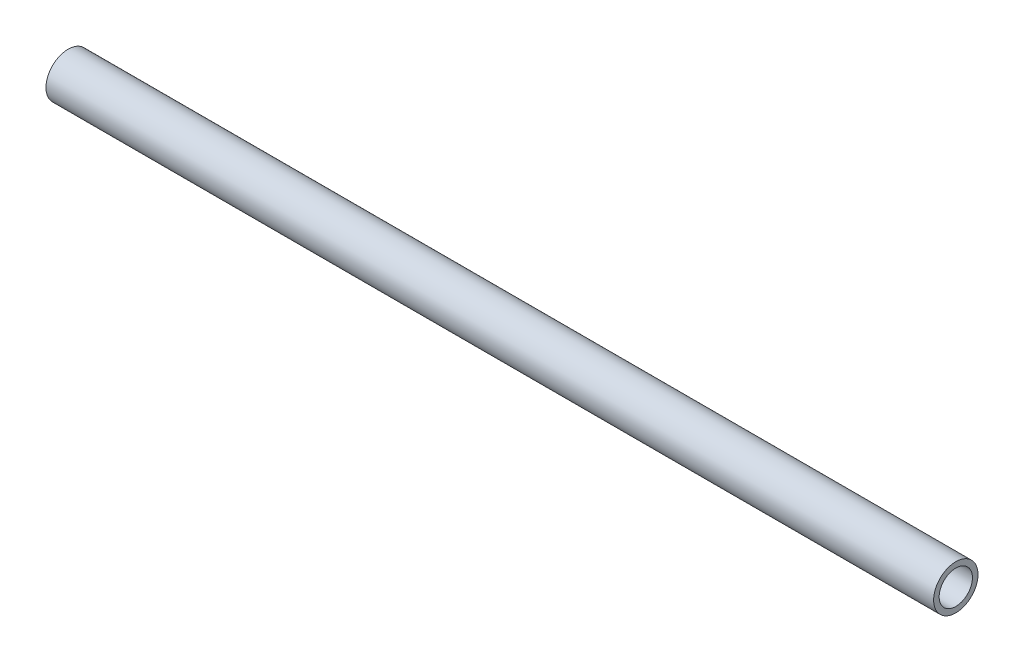
ISO-10303-21;
HEADER;
FILE_DESCRIPTION(('STEP AP214'),'2;1');
FILE_NAME('part.step','',(''),(''),'','','');
FILE_SCHEMA(('AUTOMOTIVE_DESIGN { 1 0 10303 214 1 1 1 1 }'));
ENDSEC;
DATA;
#1=APPLICATION_CONTEXT('core data for automotive mechanical design processes');
#2=APPLICATION_PROTOCOL_DEFINITION('international standard','automotive_design',2000,#1);
#3=PRODUCT_CONTEXT('',#1,'mechanical');
#4=PRODUCT('Part','Part','',(#3));
#5=PRODUCT_RELATED_PRODUCT_CATEGORY('part','',(#4));
#6=PRODUCT_DEFINITION_FORMATION('','',#4);
#7=PRODUCT_DEFINITION_CONTEXT('part definition',#1,'design');
#8=PRODUCT_DEFINITION('design','',#6,#7);
#9=PRODUCT_DEFINITION_SHAPE('','',#8);
#10=(LENGTH_UNIT() NAMED_UNIT(*) SI_UNIT(.MILLI.,.METRE.));
#11=(NAMED_UNIT(*) PLANE_ANGLE_UNIT() SI_UNIT($,.RADIAN.));
#12=(NAMED_UNIT(*) SI_UNIT($,.STERADIAN.) SOLID_ANGLE_UNIT());
#13=UNCERTAINTY_MEASURE_WITH_UNIT(LENGTH_MEASURE(1.E-05),#10,'distance_accuracy_value','');
#14=(GEOMETRIC_REPRESENTATION_CONTEXT(3) GLOBAL_UNCERTAINTY_ASSIGNED_CONTEXT((#13)) GLOBAL_UNIT_ASSIGNED_CONTEXT((#10,
#11,#12)) REPRESENTATION_CONTEXT('',''));
#15=CARTESIAN_POINT('',(0.,0.,0.));
#16=DIRECTION('',(0.,0.,1.));
#17=DIRECTION('',(1.,0.,0.));
#18=AXIS2_PLACEMENT_3D('',#15,#16,#17);
#19=CARTESIAN_POINT('',(457.2,0.,0.));
#20=DIRECTION('',(1.,0.,0.));
#21=DIRECTION('',(0.,0.,-1.));
#22=AXIS2_PLACEMENT_3D('',#19,#20,#21);
#23=PLANE('',#22);
#24=CARTESIAN_POINT('',(457.2,0.,0.));
#25=DIRECTION('',(1.,0.,0.));
#26=DIRECTION('',(0.,0.,-1.));
#27=AXIS2_PLACEMENT_3D('',#24,#25,#26);
#28=CIRCLE('',#27,12.7);
#29=CARTESIAN_POINT('',(457.2,0.,-12.7));
#30=VERTEX_POINT('',#29);
#31=EDGE_CURVE('E11',#30,#30,#28,.T.);
#32=ORIENTED_EDGE('',*,*,#31,.T.);
#33=EDGE_LOOP('',(#32));
#34=FACE_BOUND('',#33,.T.);
#35=CARTESIAN_POINT('',(457.2,0.,0.));
#36=DIRECTION('',(1.,0.,0.));
#37=DIRECTION('',(0.,0.,-1.));
#38=AXIS2_PLACEMENT_3D('',#35,#36,#37);
#39=CIRCLE('',#38,9.525);
#40=CARTESIAN_POINT('',(457.2,0.,-9.525));
#41=VERTEX_POINT('',#40);
#42=EDGE_CURVE('E43',#41,#41,#39,.T.);
#43=ORIENTED_EDGE('',*,*,#42,.F.);
#44=EDGE_LOOP('',(#43));
#45=FACE_BOUND('',#44,.T.);
#46=ADVANCED_FACE('F36',(#34,#45),#23,.T.);
#47=CARTESIAN_POINT('',(457.2,0.,0.));
#48=DIRECTION('',(-1.,0.,0.));
#49=DIRECTION('',(0.,0.,1.));
#50=AXIS2_PLACEMENT_3D('',#47,#48,#49);
#51=CYLINDRICAL_SURFACE('',#50,12.7);
#52=CARTESIAN_POINT('',(-50.8,0.,0.));
#53=DIRECTION('',(1.,0.,0.));
#54=DIRECTION('',(0.,0.,-1.));
#55=AXIS2_PLACEMENT_3D('',#52,#53,#54);
#56=CIRCLE('',#55,12.7);
#57=CARTESIAN_POINT('',(-50.8,0.,-12.7));
#58=VERTEX_POINT('',#57);
#59=EDGE_CURVE('E51',#58,#58,#56,.F.);
#60=ORIENTED_EDGE('',*,*,#59,.F.);
#61=EDGE_LOOP('',(#60));
#62=FACE_BOUND('',#61,.T.);
#63=ORIENTED_EDGE('',*,*,#31,.F.);
#64=EDGE_LOOP('',(#63));
#65=FACE_BOUND('',#64,.T.);
#66=ADVANCED_FACE('F38',(#62,#65),#51,.T.);
#67=CARTESIAN_POINT('',(457.2,0.,0.));
#68=DIRECTION('',(-1.,0.,0.));
#69=DIRECTION('',(0.,0.,1.));
#70=AXIS2_PLACEMENT_3D('',#67,#68,#69);
#71=CYLINDRICAL_SURFACE('',#70,9.525);
#72=CARTESIAN_POINT('',(-50.8,0.,0.));
#73=DIRECTION('',(1.,0.,0.));
#74=DIRECTION('',(0.,0.,-1.));
#75=AXIS2_PLACEMENT_3D('',#72,#73,#74);
#76=CIRCLE('',#75,9.525);
#77=CARTESIAN_POINT('',(-50.8,0.,-9.525));
#78=VERTEX_POINT('',#77);
#79=EDGE_CURVE('E47',#78,#78,#76,.F.);
#80=ORIENTED_EDGE('',*,*,#79,.T.);
#81=EDGE_LOOP('',(#80));
#82=FACE_BOUND('',#81,.T.);
#83=ORIENTED_EDGE('',*,*,#42,.T.);
#84=EDGE_LOOP('',(#83));
#85=FACE_BOUND('',#84,.T.);
#86=ADVANCED_FACE('F62',(#82,#85),#71,.F.);
#87=CARTESIAN_POINT('',(-50.8,0.,0.));
#88=DIRECTION('',(1.,0.,0.));
#89=DIRECTION('',(0.,0.,-1.));
#90=AXIS2_PLACEMENT_3D('',#87,#88,#89);
#91=PLANE('',#90);
#92=ORIENTED_EDGE('',*,*,#59,.T.);
#93=EDGE_LOOP('',(#92));
#94=FACE_BOUND('',#93,.T.);
#95=ORIENTED_EDGE('',*,*,#79,.F.);
#96=EDGE_LOOP('',(#95));
#97=FACE_BOUND('',#96,.T.);
#98=ADVANCED_FACE('F57',(#94,#97),#91,.F.);
#99=CLOSED_SHELL('',(#46,#66,#86,#98));
#100=MANIFOLD_SOLID_BREP('B2',#99);
#101=ADVANCED_BREP_SHAPE_REPRESENTATION('',(#18,#100),#14);
#102=SHAPE_DEFINITION_REPRESENTATION(#9,#101);
ENDSEC;
END-ISO-10303-21;
